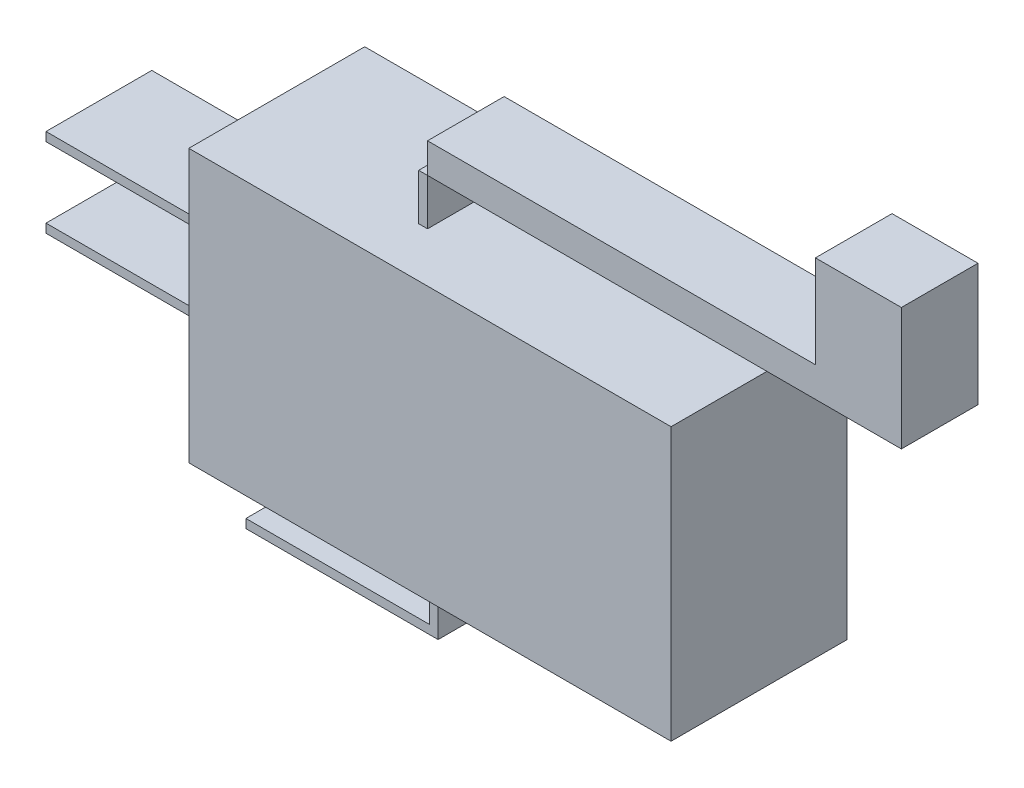
ISO-10303-21;
HEADER;
FILE_DESCRIPTION(('STEP AP214'),'2;1');
FILE_NAME('part.step','',(''),(''),'','','');
FILE_SCHEMA(('AUTOMOTIVE_DESIGN { 1 0 10303 214 1 1 1 1 }'));
ENDSEC;
DATA;
#1=APPLICATION_CONTEXT('core data for automotive mechanical design processes');
#2=APPLICATION_PROTOCOL_DEFINITION('international standard','automotive_design',2000,#1);
#3=PRODUCT_CONTEXT('',#1,'mechanical');
#4=PRODUCT('Part','Part','',(#3));
#5=PRODUCT_RELATED_PRODUCT_CATEGORY('part','',(#4));
#6=PRODUCT_DEFINITION_FORMATION('','',#4);
#7=PRODUCT_DEFINITION_CONTEXT('part definition',#1,'design');
#8=PRODUCT_DEFINITION('design','',#6,#7);
#9=PRODUCT_DEFINITION_SHAPE('','',#8);
#10=(LENGTH_UNIT() NAMED_UNIT(*) SI_UNIT(.MILLI.,.METRE.));
#11=(NAMED_UNIT(*) PLANE_ANGLE_UNIT() SI_UNIT($,.RADIAN.));
#12=(NAMED_UNIT(*) SI_UNIT($,.STERADIAN.) SOLID_ANGLE_UNIT());
#13=UNCERTAINTY_MEASURE_WITH_UNIT(LENGTH_MEASURE(1.E-05),#10,'distance_accuracy_value','');
#14=(GEOMETRIC_REPRESENTATION_CONTEXT(3) GLOBAL_UNCERTAINTY_ASSIGNED_CONTEXT((#13)) GLOBAL_UNIT_ASSIGNED_CONTEXT((#10,
#11,#12)) REPRESENTATION_CONTEXT('',''));
#15=CARTESIAN_POINT('',(0.,0.,0.));
#16=DIRECTION('',(0.,0.,1.));
#17=DIRECTION('',(1.,0.,0.));
#18=AXIS2_PLACEMENT_3D('',#15,#16,#17);
#19=CARTESIAN_POINT('',(10.8966,0.,0.));
#20=DIRECTION('',(-1.,0.,0.));
#21=DIRECTION('',(0.,0.,1.));
#22=AXIS2_PLACEMENT_3D('',#19,#20,#21);
#23=PLANE('',#22);
#24=DIRECTION('',(0.,-1.,0.));
#25=VECTOR('',#24,1.);
#26=CARTESIAN_POINT('',(10.8966,18.3642,7.2771));
#27=LINE('',#26,#25);
#28=CARTESIAN_POINT('',(10.8966,20.0914,7.2771));
#29=VERTEX_POINT('',#28);
#30=CARTESIAN_POINT('',(10.8966,18.3642,7.2771));
#31=VERTEX_POINT('',#30);
#32=EDGE_CURVE('E128',#29,#31,#27,.T.);
#33=ORIENTED_EDGE('',*,*,#32,.F.);
#34=DIRECTION('',(0.,0.,1.));
#35=VECTOR('',#34,1.);
#36=CARTESIAN_POINT('',(10.8966,20.0914,7.2771));
#37=LINE('',#36,#35);
#38=CARTESIAN_POINT('',(10.8966,20.0914,2.862513581114));
#39=VERTEX_POINT('',#38);
#40=EDGE_CURVE('E122',#39,#29,#37,.T.);
#41=ORIENTED_EDGE('',*,*,#40,.F.);
#42=DIRECTION('',(0.,1.,0.));
#43=VECTOR('',#42,1.);
#44=CARTESIAN_POINT('',(10.8966,18.3642,2.862513581114));
#45=LINE('',#44,#43);
#46=CARTESIAN_POINT('',(10.8966,18.3642,2.862513581114));
#47=VERTEX_POINT('',#46);
#48=EDGE_CURVE('E121',#47,#39,#45,.T.);
#49=ORIENTED_EDGE('',*,*,#48,.F.);
#50=DIRECTION('',(0.,0.,-1.));
#51=VECTOR('',#50,1.);
#52=CARTESIAN_POINT('',(10.8966,18.3642,7.2771));
#53=LINE('',#52,#51);
#54=EDGE_CURVE('E81',#31,#47,#53,.T.);
#55=ORIENTED_EDGE('',*,*,#54,.F.);
#56=EDGE_LOOP('',(#33,#41,#49,#55));
#57=FACE_BOUND('',#56,.T.);
#58=ADVANCED_FACE('F42',(#57),#23,.T.);
#59=CARTESIAN_POINT('',(38.2016,18.3642,7.2771));
#60=DIRECTION('',(0.,0.,-1.));
#61=DIRECTION('',(-1.,0.,0.));
#62=AXIS2_PLACEMENT_3D('',#59,#60,#61);
#63=PLANE('',#62);
#64=DIRECTION('',(-1.,0.,0.));
#65=VECTOR('',#64,1.);
#66=CARTESIAN_POINT('',(38.2016,25.4254,7.2771));
#67=LINE('',#66,#65);
#68=CARTESIAN_POINT('',(38.2016,25.4254,7.2771));
#69=VERTEX_POINT('',#68);
#70=CARTESIAN_POINT('',(33.2486,25.4254,7.2771));
#71=VERTEX_POINT('',#70);
#72=EDGE_CURVE('E136',#69,#71,#67,.T.);
#73=ORIENTED_EDGE('',*,*,#72,.T.);
#74=DIRECTION('',(0.,1.,0.));
#75=VECTOR('',#74,1.);
#76=CARTESIAN_POINT('',(33.2486,20.0914,7.2771));
#77=LINE('',#76,#75);
#78=CARTESIAN_POINT('',(33.2486,20.0914,7.2771));
#79=VERTEX_POINT('',#78);
#80=EDGE_CURVE('E111',#79,#71,#77,.T.);
#81=ORIENTED_EDGE('',*,*,#80,.F.);
#82=DIRECTION('',(1.,0.,0.));
#83=VECTOR('',#82,1.);
#84=CARTESIAN_POINT('',(33.2486,20.0914,7.2771));
#85=LINE('',#84,#83);
#86=EDGE_CURVE('E112',#29,#79,#85,.T.);
#87=ORIENTED_EDGE('',*,*,#86,.F.);
#88=ORIENTED_EDGE('',*,*,#32,.T.);
#89=DIRECTION('',(-1.,0.,0.));
#90=VECTOR('',#89,1.);
#91=CARTESIAN_POINT('',(38.2016,18.3642,7.2771));
#92=LINE('',#91,#90);
#93=CARTESIAN_POINT('',(38.2016,18.3642,7.2771));
#94=VERTEX_POINT('',#93);
#95=EDGE_CURVE('E12',#94,#31,#92,.T.);
#96=ORIENTED_EDGE('',*,*,#95,.F.);
#97=DIRECTION('',(0.,-1.,0.));
#98=VECTOR('',#97,1.);
#99=CARTESIAN_POINT('',(38.2016,18.3642,7.2771));
#100=LINE('',#99,#98);
#101=EDGE_CURVE('E130',#69,#94,#100,.T.);
#102=ORIENTED_EDGE('',*,*,#101,.F.);
#103=EDGE_LOOP('',(#73,#81,#87,#88,#96,#102));
#104=FACE_BOUND('',#103,.T.);
#105=ADVANCED_FACE('F44',(#104),#63,.F.);
#106=CARTESIAN_POINT('',(38.2016,18.3642,7.2771));
#107=DIRECTION('',(0.,1.,0.));
#108=DIRECTION('',(0.,0.,1.));
#109=AXIS2_PLACEMENT_3D('',#106,#107,#108);
#110=PLANE('',#109);
#111=ORIENTED_EDGE('',*,*,#54,.T.);
#112=DIRECTION('',(-1.,0.,0.));
#113=VECTOR('',#112,1.);
#114=CARTESIAN_POINT('',(38.2016,18.3642,2.862513581114));
#115=LINE('',#114,#113);
#116=CARTESIAN_POINT('',(38.2016,18.3642,2.862513581114));
#117=VERTEX_POINT('',#116);
#118=EDGE_CURVE('E50',#117,#47,#115,.T.);
#119=ORIENTED_EDGE('',*,*,#118,.F.);
#120=DIRECTION('',(0.,0.,-1.));
#121=VECTOR('',#120,1.);
#122=CARTESIAN_POINT('',(38.2016,18.3642,7.2771));
#123=LINE('',#122,#121);
#124=EDGE_CURVE('E86',#94,#117,#123,.T.);
#125=ORIENTED_EDGE('',*,*,#124,.F.);
#126=ORIENTED_EDGE('',*,*,#95,.T.);
#127=EDGE_LOOP('',(#111,#119,#125,#126));
#128=FACE_BOUND('',#127,.T.);
#129=ADVANCED_FACE('F165',(#128),#110,.F.);
#130=CARTESIAN_POINT('',(38.2016,18.3642,2.862513581114));
#131=DIRECTION('',(0.,0.,1.));
#132=DIRECTION('',(1.,0.,0.));
#133=AXIS2_PLACEMENT_3D('',#130,#131,#132);
#134=PLANE('',#133);
#135=DIRECTION('',(-1.,0.,0.));
#136=VECTOR('',#135,1.);
#137=CARTESIAN_POINT('',(33.2486,20.0914,2.862513581114));
#138=LINE('',#137,#136);
#139=CARTESIAN_POINT('',(33.2486,20.0914,2.862513581114));
#140=VERTEX_POINT('',#139);
#141=EDGE_CURVE('E57',#140,#39,#138,.T.);
#142=ORIENTED_EDGE('',*,*,#141,.F.);
#143=DIRECTION('',(0.,1.,0.));
#144=VECTOR('',#143,1.);
#145=CARTESIAN_POINT('',(33.2486,20.0914,2.862513581114));
#146=LINE('',#145,#144);
#147=CARTESIAN_POINT('',(33.2486,25.4254,2.862513581114));
#148=VERTEX_POINT('',#147);
#149=EDGE_CURVE('E102',#140,#148,#146,.T.);
#150=ORIENTED_EDGE('',*,*,#149,.T.);
#151=DIRECTION('',(-1.,0.,0.));
#152=VECTOR('',#151,1.);
#153=CARTESIAN_POINT('',(38.2016,25.4254,2.862513581114));
#154=LINE('',#153,#152);
#155=CARTESIAN_POINT('',(38.2016,25.4254,2.862513581114));
#156=VERTEX_POINT('',#155);
#157=EDGE_CURVE('E142',#156,#148,#154,.T.);
#158=ORIENTED_EDGE('',*,*,#157,.F.);
#159=DIRECTION('',(0.,1.,0.));
#160=VECTOR('',#159,1.);
#161=CARTESIAN_POINT('',(38.2016,18.3642,2.862513581114));
#162=LINE('',#161,#160);
#163=EDGE_CURVE('E133',#117,#156,#162,.T.);
#164=ORIENTED_EDGE('',*,*,#163,.F.);
#165=ORIENTED_EDGE('',*,*,#118,.T.);
#166=ORIENTED_EDGE('',*,*,#48,.T.);
#167=EDGE_LOOP('',(#142,#150,#158,#164,#165,#166));
#168=FACE_BOUND('',#167,.T.);
#169=ADVANCED_FACE('F119',(#168),#134,.F.);
#170=CARTESIAN_POINT('',(38.2016,25.4254,7.2771));
#171=DIRECTION('',(0.,-1.,0.));
#172=DIRECTION('',(0.,0.,-1.));
#173=AXIS2_PLACEMENT_3D('',#170,#171,#172);
#174=PLANE('',#173);
#175=ORIENTED_EDGE('',*,*,#157,.T.);
#176=DIRECTION('',(0.,0.,-1.));
#177=VECTOR('',#176,1.);
#178=CARTESIAN_POINT('',(33.2486,25.4254,7.2771));
#179=LINE('',#178,#177);
#180=EDGE_CURVE('E107',#71,#148,#179,.T.);
#181=ORIENTED_EDGE('',*,*,#180,.F.);
#182=ORIENTED_EDGE('',*,*,#72,.F.);
#183=DIRECTION('',(0.,0.,1.));
#184=VECTOR('',#183,1.);
#185=CARTESIAN_POINT('',(38.2016,25.4254,7.2771));
#186=LINE('',#185,#184);
#187=EDGE_CURVE('E66',#156,#69,#186,.T.);
#188=ORIENTED_EDGE('',*,*,#187,.F.);
#189=EDGE_LOOP('',(#175,#181,#182,#188));
#190=FACE_BOUND('',#189,.T.);
#191=ADVANCED_FACE('F150',(#190),#174,.F.);
#192=CARTESIAN_POINT('',(38.2016,0.,0.));
#193=DIRECTION('',(-1.,0.,0.));
#194=DIRECTION('',(0.,0.,1.));
#195=AXIS2_PLACEMENT_3D('',#192,#193,#194);
#196=PLANE('',#195);
#197=ORIENTED_EDGE('',*,*,#101,.T.);
#198=ORIENTED_EDGE('',*,*,#124,.T.);
#199=ORIENTED_EDGE('',*,*,#163,.T.);
#200=ORIENTED_EDGE('',*,*,#187,.T.);
#201=EDGE_LOOP('',(#197,#198,#199,#200));
#202=FACE_BOUND('',#201,.T.);
#203=ADVANCED_FACE('F151',(#202),#196,.F.);
#204=CARTESIAN_POINT('',(33.2486,20.0914,7.2771));
#205=DIRECTION('',(1.,0.,0.));
#206=DIRECTION('',(0.,0.,-1.));
#207=AXIS2_PLACEMENT_3D('',#204,#205,#206);
#208=PLANE('',#207);
#209=ORIENTED_EDGE('',*,*,#180,.T.);
#210=ORIENTED_EDGE('',*,*,#149,.F.);
#211=DIRECTION('',(0.,0.,-1.));
#212=VECTOR('',#211,1.);
#213=CARTESIAN_POINT('',(33.2486,20.0914,7.2771));
#214=LINE('',#213,#212);
#215=EDGE_CURVE('E104',#79,#140,#214,.T.);
#216=ORIENTED_EDGE('',*,*,#215,.F.);
#217=ORIENTED_EDGE('',*,*,#80,.T.);
#218=EDGE_LOOP('',(#209,#210,#216,#217));
#219=FACE_BOUND('',#218,.T.);
#220=ADVANCED_FACE('F103',(#219),#208,.F.);
#221=CARTESIAN_POINT('',(0.,20.0914,0.));
#222=DIRECTION('',(0.,1.,0.));
#223=DIRECTION('',(0.,0.,1.));
#224=AXIS2_PLACEMENT_3D('',#221,#222,#223);
#225=PLANE('',#224);
#226=ORIENTED_EDGE('',*,*,#215,.T.);
#227=ORIENTED_EDGE('',*,*,#141,.T.);
#228=ORIENTED_EDGE('',*,*,#40,.T.);
#229=ORIENTED_EDGE('',*,*,#86,.T.);
#230=EDGE_LOOP('',(#226,#227,#228,#229));
#231=FACE_BOUND('',#230,.T.);
#232=ADVANCED_FACE('F114',(#231),#225,.T.);
#233=CLOSED_SHELL('',(#58,#105,#129,#169,#191,#203,#220,#232));
#234=MANIFOLD_SOLID_BREP('B2',#233);
#235=CARTESIAN_POINT('',(11.8364,-3.6576,8.1153));
#236=DIRECTION('',(1.,0.,0.));
#237=DIRECTION('',(0.,0.,-1.));
#238=AXIS2_PLACEMENT_3D('',#235,#236,#237);
#239=PLANE('',#238);
#240=DIRECTION('',(0.,0.,-1.));
#241=VECTOR('',#240,1.);
#242=CARTESIAN_POINT('',(11.8364,-3.1496,8.1153));
#243=LINE('',#242,#241);
#244=CARTESIAN_POINT('',(11.8364,-3.1496,8.1153));
#245=VERTEX_POINT('',#244);
#246=CARTESIAN_POINT('',(11.8364,-3.1496,2.0193));
#247=VERTEX_POINT('',#246);
#248=EDGE_CURVE('E387',#245,#247,#243,.T.);
#249=ORIENTED_EDGE('',*,*,#248,.F.);
#250=DIRECTION('',(0.,1.,0.));
#251=VECTOR('',#250,1.);
#252=CARTESIAN_POINT('',(11.8364,-3.6576,8.1153));
#253=LINE('',#252,#251);
#254=CARTESIAN_POINT('',(11.8364,0.,8.1153));
#255=VERTEX_POINT('',#254);
#256=EDGE_CURVE('E392',#245,#255,#253,.T.);
#257=ORIENTED_EDGE('',*,*,#256,.T.);
#258=DIRECTION('',(0.,0.,-1.));
#259=VECTOR('',#258,1.);
#260=CARTESIAN_POINT('',(11.8364,0.,8.1153));
#261=LINE('',#260,#259);
#262=CARTESIAN_POINT('',(11.8364,0.,2.0193));
#263=VERTEX_POINT('',#262);
#264=EDGE_CURVE('E393',#255,#263,#261,.T.);
#265=ORIENTED_EDGE('',*,*,#264,.T.);
#266=DIRECTION('',(0.,1.,0.));
#267=VECTOR('',#266,1.);
#268=CARTESIAN_POINT('',(11.8364,-3.6576,2.0193));
#269=LINE('',#268,#267);
#270=EDGE_CURVE('E233',#247,#263,#269,.T.);
#271=ORIENTED_EDGE('',*,*,#270,.F.);
#272=EDGE_LOOP('',(#249,#257,#265,#271));
#273=FACE_BOUND('',#272,.T.);
#274=ADVANCED_FACE('F218',(#273),#239,.F.);
#275=CARTESIAN_POINT('',(0.,0.,10.1346));
#276=DIRECTION('',(0.,1.,0.));
#277=DIRECTION('',(0.,0.,1.));
#278=AXIS2_PLACEMENT_3D('',#275,#276,#277);
#279=PLANE('',#278);
#280=DIRECTION('',(1.,0.,0.));
#281=VECTOR('',#280,1.);
#282=CARTESIAN_POINT('',(0.,0.,0.));
#283=LINE('',#282,#281);
#284=CARTESIAN_POINT('',(0.,0.,0.));
#285=VERTEX_POINT('',#284);
#286=CARTESIAN_POINT('',(27.7876,0.,0.));
#287=VERTEX_POINT('',#286);
#288=EDGE_CURVE('E527',#285,#287,#283,.T.);
#289=ORIENTED_EDGE('',*,*,#288,.T.);
#290=DIRECTION('',(0.,0.,-1.));
#291=VECTOR('',#290,1.);
#292=CARTESIAN_POINT('',(27.7876,0.,10.1346));
#293=LINE('',#292,#291);
#294=CARTESIAN_POINT('',(27.7876,0.,10.1346));
#295=VERTEX_POINT('',#294);
#296=EDGE_CURVE('E226',#295,#287,#293,.T.);
#297=ORIENTED_EDGE('',*,*,#296,.F.);
#298=DIRECTION('',(1.,0.,0.));
#299=VECTOR('',#298,1.);
#300=CARTESIAN_POINT('',(0.,0.,10.1346));
#301=LINE('',#300,#299);
#302=CARTESIAN_POINT('',(0.,0.,10.1346));
#303=VERTEX_POINT('',#302);
#304=EDGE_CURVE('E517',#303,#295,#301,.T.);
#305=ORIENTED_EDGE('',*,*,#304,.F.);
#306=DIRECTION('',(0.,0.,-1.));
#307=VECTOR('',#306,1.);
#308=CARTESIAN_POINT('',(0.,0.,10.1346));
#309=LINE('',#308,#307);
#310=EDGE_CURVE('E40',#303,#285,#309,.T.);
#311=ORIENTED_EDGE('',*,*,#310,.T.);
#312=EDGE_LOOP('',(#289,#297,#305,#311));
#313=FACE_BOUND('',#312,.T.);
#314=ORIENTED_EDGE('',*,*,#264,.F.);
#315=DIRECTION('',(-1.,0.,0.));
#316=VECTOR('',#315,1.);
#317=CARTESIAN_POINT('',(12.3444,0.,8.1153));
#318=LINE('',#317,#316);
#319=CARTESIAN_POINT('',(12.3444,0.,8.1153));
#320=VERTEX_POINT('',#319);
#321=EDGE_CURVE('E404',#320,#255,#318,.T.);
#322=ORIENTED_EDGE('',*,*,#321,.F.);
#323=DIRECTION('',(0.,0.,1.));
#324=VECTOR('',#323,1.);
#325=CARTESIAN_POINT('',(12.3444,0.,8.1153));
#326=LINE('',#325,#324);
#327=CARTESIAN_POINT('',(12.3444,0.,2.0193));
#328=VERTEX_POINT('',#327);
#329=EDGE_CURVE('E240',#328,#320,#326,.T.);
#330=ORIENTED_EDGE('',*,*,#329,.F.);
#331=DIRECTION('',(1.,0.,0.));
#332=VECTOR('',#331,1.);
#333=CARTESIAN_POINT('',(12.3444,0.,2.0193));
#334=LINE('',#333,#332);
#335=EDGE_CURVE('E396',#263,#328,#334,.T.);
#336=ORIENTED_EDGE('',*,*,#335,.F.);
#337=EDGE_LOOP('',(#314,#322,#330,#336));
#338=FACE_BOUND('',#337,.T.);
#339=ADVANCED_FACE('F559',(#313,#338),#279,.F.);
#340=CARTESIAN_POINT('',(0.,15.6972,10.1346));
#341=DIRECTION('',(0.,-1.,0.));
#342=DIRECTION('',(0.,0.,-1.));
#343=AXIS2_PLACEMENT_3D('',#340,#341,#342);
#344=PLANE('',#343);
#345=DIRECTION('',(-1.,0.,0.));
#346=VECTOR('',#345,1.);
#347=CARTESIAN_POINT('',(0.,15.6972,0.));
#348=LINE('',#347,#346);
#349=CARTESIAN_POINT('',(27.7876,15.6972,0.));
#350=VERTEX_POINT('',#349);
#351=CARTESIAN_POINT('',(0.,15.6972,0.));
#352=VERTEX_POINT('',#351);
#353=EDGE_CURVE('E518',#350,#352,#348,.T.);
#354=ORIENTED_EDGE('',*,*,#353,.T.);
#355=DIRECTION('',(0.,0.,-1.));
#356=VECTOR('',#355,1.);
#357=CARTESIAN_POINT('',(0.,15.6972,10.1346));
#358=LINE('',#357,#356);
#359=CARTESIAN_POINT('',(0.,15.6972,10.1346));
#360=VERTEX_POINT('',#359);
#361=EDGE_CURVE('E524',#360,#352,#358,.T.);
#362=ORIENTED_EDGE('',*,*,#361,.F.);
#363=DIRECTION('',(-1.,0.,0.));
#364=VECTOR('',#363,1.);
#365=CARTESIAN_POINT('',(0.,15.6972,10.1346));
#366=LINE('',#365,#364);
#367=CARTESIAN_POINT('',(27.7876,15.6972,10.1346));
#368=VERTEX_POINT('',#367);
#369=EDGE_CURVE('E522',#368,#360,#366,.T.);
#370=ORIENTED_EDGE('',*,*,#369,.F.);
#371=DIRECTION('',(0.,0.,-1.));
#372=VECTOR('',#371,1.);
#373=CARTESIAN_POINT('',(27.7876,15.6972,10.1346));
#374=LINE('',#373,#372);
#375=EDGE_CURVE('E534',#368,#350,#374,.T.);
#376=ORIENTED_EDGE('',*,*,#375,.T.);
#377=EDGE_LOOP('',(#354,#362,#370,#376));
#378=FACE_BOUND('',#377,.T.);
#379=DIRECTION('',(0.,0.,-1.));
#380=VECTOR('',#379,1.);
#381=CARTESIAN_POINT('',(10.8966,15.6972,7.2771));
#382=LINE('',#381,#380);
#383=CARTESIAN_POINT('',(10.8966,15.6972,7.2771));
#384=VERTEX_POINT('',#383);
#385=CARTESIAN_POINT('',(10.8966,15.6972,2.8575));
#386=VERTEX_POINT('',#385);
#387=EDGE_CURVE('E419',#384,#386,#382,.T.);
#388=ORIENTED_EDGE('',*,*,#387,.F.);
#389=DIRECTION('',(1.,0.,0.));
#390=VECTOR('',#389,1.);
#391=CARTESIAN_POINT('',(10.3886,15.6972,7.2771));
#392=LINE('',#391,#390);
#393=CARTESIAN_POINT('',(10.3886,15.6972,7.2771));
#394=VERTEX_POINT('',#393);
#395=EDGE_CURVE('E423',#394,#384,#392,.T.);
#396=ORIENTED_EDGE('',*,*,#395,.F.);
#397=DIRECTION('',(0.,0.,1.));
#398=VECTOR('',#397,1.);
#399=CARTESIAN_POINT('',(10.3886,15.6972,7.2771));
#400=LINE('',#399,#398);
#401=CARTESIAN_POINT('',(10.3886,15.6972,2.8575));
#402=VERTEX_POINT('',#401);
#403=EDGE_CURVE('E435',#402,#394,#400,.T.);
#404=ORIENTED_EDGE('',*,*,#403,.F.);
#405=DIRECTION('',(-1.,0.,0.));
#406=VECTOR('',#405,1.);
#407=CARTESIAN_POINT('',(10.3886,15.6972,2.8575));
#408=LINE('',#407,#406);
#409=EDGE_CURVE('E432',#386,#402,#408,.T.);
#410=ORIENTED_EDGE('',*,*,#409,.F.);
#411=EDGE_LOOP('',(#388,#396,#404,#410));
#412=FACE_BOUND('',#411,.T.);
#413=ADVANCED_FACE('F550',(#378,#412),#344,.F.);
#414=CARTESIAN_POINT('',(0.,0.,10.1346));
#415=DIRECTION('',(1.,0.,0.));
#416=DIRECTION('',(0.,0.,-1.));
#417=AXIS2_PLACEMENT_3D('',#414,#415,#416);
#418=PLANE('',#417);
#419=DIRECTION('',(0.,-1.,0.));
#420=VECTOR('',#419,1.);
#421=CARTESIAN_POINT('',(0.,0.,0.));
#422=LINE('',#421,#420);
#423=EDGE_CURVE('E506',#352,#285,#422,.T.);
#424=ORIENTED_EDGE('',*,*,#423,.T.);
#425=ORIENTED_EDGE('',*,*,#310,.F.);
#426=DIRECTION('',(0.,-1.,0.));
#427=VECTOR('',#426,1.);
#428=CARTESIAN_POINT('',(0.,0.,10.1346));
#429=LINE('',#428,#427);
#430=EDGE_CURVE('E514',#360,#303,#429,.T.);
#431=ORIENTED_EDGE('',*,*,#430,.F.);
#432=ORIENTED_EDGE('',*,*,#361,.T.);
#433=EDGE_LOOP('',(#424,#425,#431,#432));
#434=FACE_BOUND('',#433,.T.);
#435=DIRECTION('',(0.,0.,1.));
#436=VECTOR('',#435,1.);
#437=CARTESIAN_POINT('',(0.,9.8806,2.0066));
#438=LINE('',#437,#436);
#439=CARTESIAN_POINT('',(0.,9.8806,2.0066));
#440=VERTEX_POINT('',#439);
#441=CARTESIAN_POINT('',(0.,9.8806,8.1026));
#442=VERTEX_POINT('',#441);
#443=EDGE_CURVE('E488',#440,#442,#438,.T.);
#444=ORIENTED_EDGE('',*,*,#443,.F.);
#445=DIRECTION('',(0.,1.,0.));
#446=VECTOR('',#445,1.);
#447=CARTESIAN_POINT('',(0.,9.8806,2.0066));
#448=LINE('',#447,#446);
#449=CARTESIAN_POINT('',(0.,10.3886,2.0066));
#450=VERTEX_POINT('',#449);
#451=EDGE_CURVE('E474',#440,#450,#448,.T.);
#452=ORIENTED_EDGE('',*,*,#451,.T.);
#453=DIRECTION('',(0.,0.,1.));
#454=VECTOR('',#453,1.);
#455=CARTESIAN_POINT('',(0.,10.3886,2.0066));
#456=LINE('',#455,#454);
#457=CARTESIAN_POINT('',(0.,10.3886,8.1026));
#458=VERTEX_POINT('',#457);
#459=EDGE_CURVE('E498',#450,#458,#456,.T.);
#460=ORIENTED_EDGE('',*,*,#459,.T.);
#461=DIRECTION('',(0.,1.,0.));
#462=VECTOR('',#461,1.);
#463=CARTESIAN_POINT('',(0.,9.8806,8.1026));
#464=LINE('',#463,#462);
#465=EDGE_CURVE('E501',#442,#458,#464,.T.);
#466=ORIENTED_EDGE('',*,*,#465,.F.);
#467=EDGE_LOOP('',(#444,#452,#460,#466));
#468=FACE_BOUND('',#467,.T.);
#469=DIRECTION('',(0.,-1.,0.));
#470=VECTOR('',#469,1.);
#471=CARTESIAN_POINT('',(0.,5.8166,2.0066));
#472=LINE('',#471,#470);
#473=CARTESIAN_POINT('',(0.,5.8166,2.0066));
#474=VERTEX_POINT('',#473);
#475=CARTESIAN_POINT('',(0.,5.3086,2.0066));
#476=VERTEX_POINT('',#475);
#477=EDGE_CURVE('E471',#474,#476,#472,.T.);
#478=ORIENTED_EDGE('',*,*,#477,.F.);
#479=DIRECTION('',(0.,0.,1.));
#480=VECTOR('',#479,1.);
#481=CARTESIAN_POINT('',(0.,5.8166,2.0066));
#482=LINE('',#481,#480);
#483=CARTESIAN_POINT('',(0.,5.8166,8.1026));
#484=VERTEX_POINT('',#483);
#485=EDGE_CURVE('E461',#474,#484,#482,.T.);
#486=ORIENTED_EDGE('',*,*,#485,.T.);
#487=DIRECTION('',(0.,-1.,0.));
#488=VECTOR('',#487,1.);
#489=CARTESIAN_POINT('',(0.,5.8166,8.1026));
#490=LINE('',#489,#488);
#491=CARTESIAN_POINT('',(0.,5.3086,8.1026));
#492=VERTEX_POINT('',#491);
#493=EDGE_CURVE('E464',#484,#492,#490,.T.);
#494=ORIENTED_EDGE('',*,*,#493,.T.);
#495=DIRECTION('',(0.,0.,1.));
#496=VECTOR('',#495,1.);
#497=CARTESIAN_POINT('',(0.,5.3086,2.0066));
#498=LINE('',#497,#496);
#499=EDGE_CURVE('E468',#476,#492,#498,.T.);
#500=ORIENTED_EDGE('',*,*,#499,.F.);
#501=EDGE_LOOP('',(#478,#486,#494,#500));
#502=FACE_BOUND('',#501,.T.);
#503=ADVANCED_FACE('F220',(#434,#468,#502),#418,.F.);
#504=CARTESIAN_POINT('',(27.7876,0.,10.1346));
#505=DIRECTION('',(-1.,0.,0.));
#506=DIRECTION('',(0.,0.,1.));
#507=AXIS2_PLACEMENT_3D('',#504,#505,#506);
#508=PLANE('',#507);
#509=DIRECTION('',(0.,1.,0.));
#510=VECTOR('',#509,1.);
#511=CARTESIAN_POINT('',(27.7876,0.,0.));
#512=LINE('',#511,#510);
#513=EDGE_CURVE('E529',#287,#350,#512,.T.);
#514=ORIENTED_EDGE('',*,*,#513,.T.);
#515=ORIENTED_EDGE('',*,*,#375,.F.);
#516=DIRECTION('',(0.,1.,0.));
#517=VECTOR('',#516,1.);
#518=CARTESIAN_POINT('',(27.7876,0.,10.1346));
#519=LINE('',#518,#517);
#520=EDGE_CURVE('E520',#295,#368,#519,.T.);
#521=ORIENTED_EDGE('',*,*,#520,.F.);
#522=ORIENTED_EDGE('',*,*,#296,.T.);
#523=EDGE_LOOP('',(#514,#515,#521,#522));
#524=FACE_BOUND('',#523,.T.);
#525=ADVANCED_FACE('F541',(#524),#508,.F.);
#526=CARTESIAN_POINT('',(0.,0.,10.1346));
#527=DIRECTION('',(0.,0.,-1.));
#528=DIRECTION('',(-1.,0.,0.));
#529=AXIS2_PLACEMENT_3D('',#526,#527,#528);
#530=PLANE('',#529);
#531=ORIENTED_EDGE('',*,*,#430,.T.);
#532=ORIENTED_EDGE('',*,*,#304,.T.);
#533=ORIENTED_EDGE('',*,*,#520,.T.);
#534=ORIENTED_EDGE('',*,*,#369,.T.);
#535=EDGE_LOOP('',(#531,#532,#533,#534));
#536=FACE_BOUND('',#535,.T.);
#537=ADVANCED_FACE('F558',(#536),#530,.F.);
#538=CARTESIAN_POINT('',(0.,0.,0.));
#539=DIRECTION('',(0.,0.,-1.));
#540=DIRECTION('',(-1.,0.,0.));
#541=AXIS2_PLACEMENT_3D('',#538,#539,#540);
#542=PLANE('',#541);
#543=ORIENTED_EDGE('',*,*,#423,.F.);
#544=ORIENTED_EDGE('',*,*,#353,.F.);
#545=ORIENTED_EDGE('',*,*,#513,.F.);
#546=ORIENTED_EDGE('',*,*,#288,.F.);
#547=EDGE_LOOP('',(#543,#544,#545,#546));
#548=FACE_BOUND('',#547,.T.);
#549=ADVANCED_FACE('F547',(#548),#542,.T.);
#550=CARTESIAN_POINT('',(-10.2616,9.8806,2.0066));
#551=DIRECTION('',(0.,0.,-1.));
#552=DIRECTION('',(-1.,0.,0.));
#553=AXIS2_PLACEMENT_3D('',#550,#551,#552);
#554=PLANE('',#553);
#555=ORIENTED_EDGE('',*,*,#451,.F.);
#556=DIRECTION('',(1.,0.,0.));
#557=VECTOR('',#556,1.);
#558=CARTESIAN_POINT('',(-10.2616,9.8806,2.0066));
#559=LINE('',#558,#557);
#560=CARTESIAN_POINT('',(-10.2616,9.8806,2.0066));
#561=VERTEX_POINT('',#560);
#562=EDGE_CURVE('E504',#561,#440,#559,.T.);
#563=ORIENTED_EDGE('',*,*,#562,.F.);
#564=DIRECTION('',(0.,1.,0.));
#565=VECTOR('',#564,1.);
#566=CARTESIAN_POINT('',(-10.2616,9.8806,2.0066));
#567=LINE('',#566,#565);
#568=CARTESIAN_POINT('',(-10.2616,10.3886,2.0066));
#569=VERTEX_POINT('',#568);
#570=EDGE_CURVE('E484',#561,#569,#567,.T.);
#571=ORIENTED_EDGE('',*,*,#570,.T.);
#572=DIRECTION('',(1.,0.,0.));
#573=VECTOR('',#572,1.);
#574=CARTESIAN_POINT('',(-10.2616,10.3886,2.0066));
#575=LINE('',#574,#573);
#576=EDGE_CURVE('E495',#569,#450,#575,.T.);
#577=ORIENTED_EDGE('',*,*,#576,.T.);
#578=EDGE_LOOP('',(#555,#563,#571,#577));
#579=FACE_BOUND('',#578,.T.);
#580=ADVANCED_FACE('F631',(#579),#554,.T.);
#581=CARTESIAN_POINT('',(-10.2616,9.8806,2.0066));
#582=DIRECTION('',(0.,1.,0.));
#583=DIRECTION('',(0.,0.,1.));
#584=AXIS2_PLACEMENT_3D('',#581,#582,#583);
#585=PLANE('',#584);
#586=ORIENTED_EDGE('',*,*,#443,.T.);
#587=DIRECTION('',(1.,0.,0.));
#588=VECTOR('',#587,1.);
#589=CARTESIAN_POINT('',(-10.2616,9.8806,8.1026));
#590=LINE('',#589,#588);
#591=CARTESIAN_POINT('',(-10.2616,9.8806,8.1026));
#592=VERTEX_POINT('',#591);
#593=EDGE_CURVE('E507',#592,#442,#590,.T.);
#594=ORIENTED_EDGE('',*,*,#593,.F.);
#595=DIRECTION('',(0.,0.,1.));
#596=VECTOR('',#595,1.);
#597=CARTESIAN_POINT('',(-10.2616,9.8806,2.0066));
#598=LINE('',#597,#596);
#599=EDGE_CURVE('E493',#561,#592,#598,.T.);
#600=ORIENTED_EDGE('',*,*,#599,.F.);
#601=ORIENTED_EDGE('',*,*,#562,.T.);
#602=EDGE_LOOP('',(#586,#594,#600,#601));
#603=FACE_BOUND('',#602,.T.);
#604=ADVANCED_FACE('F627',(#603),#585,.F.);
#605=CARTESIAN_POINT('',(-10.2616,9.8806,8.1026));
#606=DIRECTION('',(0.,0.,-1.));
#607=DIRECTION('',(-1.,0.,0.));
#608=AXIS2_PLACEMENT_3D('',#605,#606,#607);
#609=PLANE('',#608);
#610=ORIENTED_EDGE('',*,*,#465,.T.);
#611=DIRECTION('',(1.,0.,0.));
#612=VECTOR('',#611,1.);
#613=CARTESIAN_POINT('',(-10.2616,10.3886,8.1026));
#614=LINE('',#613,#612);
#615=CARTESIAN_POINT('',(-10.2616,10.3886,8.1026));
#616=VERTEX_POINT('',#615);
#617=EDGE_CURVE('E510',#616,#458,#614,.T.);
#618=ORIENTED_EDGE('',*,*,#617,.F.);
#619=DIRECTION('',(0.,1.,0.));
#620=VECTOR('',#619,1.);
#621=CARTESIAN_POINT('',(-10.2616,9.8806,8.1026));
#622=LINE('',#621,#620);
#623=EDGE_CURVE('E491',#592,#616,#622,.T.);
#624=ORIENTED_EDGE('',*,*,#623,.F.);
#625=ORIENTED_EDGE('',*,*,#593,.T.);
#626=EDGE_LOOP('',(#610,#618,#624,#625));
#627=FACE_BOUND('',#626,.T.);
#628=ADVANCED_FACE('F630',(#627),#609,.F.);
#629=CARTESIAN_POINT('',(-10.2616,10.3886,2.0066));
#630=DIRECTION('',(0.,1.,0.));
#631=DIRECTION('',(0.,0.,1.));
#632=AXIS2_PLACEMENT_3D('',#629,#630,#631);
#633=PLANE('',#632);
#634=ORIENTED_EDGE('',*,*,#459,.F.);
#635=ORIENTED_EDGE('',*,*,#576,.F.);
#636=DIRECTION('',(0.,0.,1.));
#637=VECTOR('',#636,1.);
#638=CARTESIAN_POINT('',(-10.2616,10.3886,2.0066));
#639=LINE('',#638,#637);
#640=EDGE_CURVE('E487',#569,#616,#639,.T.);
#641=ORIENTED_EDGE('',*,*,#640,.T.);
#642=ORIENTED_EDGE('',*,*,#617,.T.);
#643=EDGE_LOOP('',(#634,#635,#641,#642));
#644=FACE_BOUND('',#643,.T.);
#645=ADVANCED_FACE('F625',(#644),#633,.T.);
#646=CARTESIAN_POINT('',(-10.2616,0.,0.));
#647=DIRECTION('',(1.,0.,0.));
#648=DIRECTION('',(0.,0.,-1.));
#649=AXIS2_PLACEMENT_3D('',#646,#647,#648);
#650=PLANE('',#649);
#651=ORIENTED_EDGE('',*,*,#570,.F.);
#652=ORIENTED_EDGE('',*,*,#599,.T.);
#653=ORIENTED_EDGE('',*,*,#623,.T.);
#654=ORIENTED_EDGE('',*,*,#640,.F.);
#655=EDGE_LOOP('',(#651,#652,#653,#654));
#656=FACE_BOUND('',#655,.T.);
#657=ADVANCED_FACE('F607',(#656),#650,.F.);
#658=CARTESIAN_POINT('',(-10.2616,5.8166,2.0066));
#659=DIRECTION('',(0.,0.,1.));
#660=DIRECTION('',(1.,0.,0.));
#661=AXIS2_PLACEMENT_3D('',#658,#659,#660);
#662=PLANE('',#661);
#663=ORIENTED_EDGE('',*,*,#477,.T.);
#664=DIRECTION('',(1.,0.,0.));
#665=VECTOR('',#664,1.);
#666=CARTESIAN_POINT('',(-10.2616,5.3086,2.0066));
#667=LINE('',#666,#665);
#668=CARTESIAN_POINT('',(-10.2616,5.3086,2.0066));
#669=VERTEX_POINT('',#668);
#670=EDGE_CURVE('E451',#669,#476,#667,.T.);
#671=ORIENTED_EDGE('',*,*,#670,.F.);
#672=DIRECTION('',(0.,-1.,0.));
#673=VECTOR('',#672,1.);
#674=CARTESIAN_POINT('',(-10.2616,5.8166,2.0066));
#675=LINE('',#674,#673);
#676=CARTESIAN_POINT('',(-10.2616,5.8166,2.0066));
#677=VERTEX_POINT('',#676);
#678=EDGE_CURVE('E465',#677,#669,#675,.T.);
#679=ORIENTED_EDGE('',*,*,#678,.F.);
#680=DIRECTION('',(1.,0.,0.));
#681=VECTOR('',#680,1.);
#682=CARTESIAN_POINT('',(-10.2616,5.8166,2.0066));
#683=LINE('',#682,#681);
#684=EDGE_CURVE('E458',#677,#474,#683,.T.);
#685=ORIENTED_EDGE('',*,*,#684,.T.);
#686=EDGE_LOOP('',(#663,#671,#679,#685));
#687=FACE_BOUND('',#686,.T.);
#688=ADVANCED_FACE('F603',(#687),#662,.F.);
#689=CARTESIAN_POINT('',(-10.2616,5.3086,2.0066));
#690=DIRECTION('',(0.,1.,0.));
#691=DIRECTION('',(0.,0.,1.));
#692=AXIS2_PLACEMENT_3D('',#689,#690,#691);
#693=PLANE('',#692);
#694=ORIENTED_EDGE('',*,*,#499,.T.);
#695=DIRECTION('',(1.,0.,0.));
#696=VECTOR('',#695,1.);
#697=CARTESIAN_POINT('',(-10.2616,5.3086,8.1026));
#698=LINE('',#697,#696);
#699=CARTESIAN_POINT('',(-10.2616,5.3086,8.1026));
#700=VERTEX_POINT('',#699);
#701=EDGE_CURVE('E453',#700,#492,#698,.T.);
#702=ORIENTED_EDGE('',*,*,#701,.F.);
#703=DIRECTION('',(0.,0.,1.));
#704=VECTOR('',#703,1.);
#705=CARTESIAN_POINT('',(-10.2616,5.3086,2.0066));
#706=LINE('',#705,#704);
#707=EDGE_CURVE('E480',#669,#700,#706,.T.);
#708=ORIENTED_EDGE('',*,*,#707,.F.);
#709=ORIENTED_EDGE('',*,*,#670,.T.);
#710=EDGE_LOOP('',(#694,#702,#708,#709));
#711=FACE_BOUND('',#710,.T.);
#712=ADVANCED_FACE('F606',(#711),#693,.F.);
#713=CARTESIAN_POINT('',(-10.2616,5.8166,8.1026));
#714=DIRECTION('',(0.,0.,1.));
#715=DIRECTION('',(1.,0.,0.));
#716=AXIS2_PLACEMENT_3D('',#713,#714,#715);
#717=PLANE('',#716);
#718=ORIENTED_EDGE('',*,*,#493,.F.);
#719=DIRECTION('',(1.,0.,0.));
#720=VECTOR('',#719,1.);
#721=CARTESIAN_POINT('',(-10.2616,5.8166,8.1026));
#722=LINE('',#721,#720);
#723=CARTESIAN_POINT('',(-10.2616,5.8166,8.1026));
#724=VERTEX_POINT('',#723);
#725=EDGE_CURVE('E455',#724,#484,#722,.T.);
#726=ORIENTED_EDGE('',*,*,#725,.F.);
#727=DIRECTION('',(0.,-1.,0.));
#728=VECTOR('',#727,1.);
#729=CARTESIAN_POINT('',(-10.2616,5.8166,8.1026));
#730=LINE('',#729,#728);
#731=EDGE_CURVE('E477',#724,#700,#730,.T.);
#732=ORIENTED_EDGE('',*,*,#731,.T.);
#733=ORIENTED_EDGE('',*,*,#701,.T.);
#734=EDGE_LOOP('',(#718,#726,#732,#733));
#735=FACE_BOUND('',#734,.T.);
#736=ADVANCED_FACE('F611',(#735),#717,.T.);
#737=CARTESIAN_POINT('',(-10.2616,5.8166,2.0066));
#738=DIRECTION('',(0.,1.,0.));
#739=DIRECTION('',(0.,0.,1.));
#740=AXIS2_PLACEMENT_3D('',#737,#738,#739);
#741=PLANE('',#740);
#742=ORIENTED_EDGE('',*,*,#485,.F.);
#743=ORIENTED_EDGE('',*,*,#684,.F.);
#744=DIRECTION('',(0.,0.,1.));
#745=VECTOR('',#744,1.);
#746=CARTESIAN_POINT('',(-10.2616,5.8166,2.0066));
#747=LINE('',#746,#745);
#748=EDGE_CURVE('E460',#677,#724,#747,.T.);
#749=ORIENTED_EDGE('',*,*,#748,.T.);
#750=ORIENTED_EDGE('',*,*,#725,.T.);
#751=EDGE_LOOP('',(#742,#743,#749,#750));
#752=FACE_BOUND('',#751,.T.);
#753=ADVANCED_FACE('F615',(#752),#741,.T.);
#754=CARTESIAN_POINT('',(-10.2616,0.,0.));
#755=DIRECTION('',(-1.,0.,0.));
#756=DIRECTION('',(0.,0.,1.));
#757=AXIS2_PLACEMENT_3D('',#754,#755,#756);
#758=PLANE('',#757);
#759=ORIENTED_EDGE('',*,*,#678,.T.);
#760=ORIENTED_EDGE('',*,*,#707,.T.);
#761=ORIENTED_EDGE('',*,*,#731,.F.);
#762=ORIENTED_EDGE('',*,*,#748,.F.);
#763=EDGE_LOOP('',(#759,#760,#761,#762));
#764=FACE_BOUND('',#763,.T.);
#765=ADVANCED_FACE('F601',(#764),#758,.T.);
#766=CARTESIAN_POINT('',(10.8966,18.3642,7.2771));
#767=DIRECTION('',(-1.,0.,0.));
#768=DIRECTION('',(0.,0.,1.));
#769=AXIS2_PLACEMENT_3D('',#766,#767,#768);
#770=PLANE('',#769);
#771=ORIENTED_EDGE('',*,*,#387,.T.);
#772=DIRECTION('',(0.,-1.,0.));
#773=VECTOR('',#772,1.);
#774=CARTESIAN_POINT('',(10.8966,18.3642,2.8575));
#775=LINE('',#774,#773);
#776=CARTESIAN_POINT('',(10.8966,18.3642,2.8575));
#777=VERTEX_POINT('',#776);
#778=EDGE_CURVE('E448',#777,#386,#775,.T.);
#779=ORIENTED_EDGE('',*,*,#778,.F.);
#780=DIRECTION('',(0.,0.,-1.));
#781=VECTOR('',#780,1.);
#782=CARTESIAN_POINT('',(10.8966,18.3642,7.2771));
#783=LINE('',#782,#781);
#784=CARTESIAN_POINT('',(10.8966,18.3642,7.2771));
#785=VERTEX_POINT('',#784);
#786=EDGE_CURVE('E420',#785,#777,#783,.T.);
#787=ORIENTED_EDGE('',*,*,#786,.F.);
#788=DIRECTION('',(0.,-1.,0.));
#789=VECTOR('',#788,1.);
#790=CARTESIAN_POINT('',(10.8966,18.3642,7.2771));
#791=LINE('',#790,#789);
#792=EDGE_CURVE('E429',#785,#384,#791,.T.);
#793=ORIENTED_EDGE('',*,*,#792,.T.);
#794=EDGE_LOOP('',(#771,#779,#787,#793));
#795=FACE_BOUND('',#794,.T.);
#796=ADVANCED_FACE('F597',(#795),#770,.F.);
#797=CARTESIAN_POINT('',(10.3886,18.3642,2.8575));
#798=DIRECTION('',(0.,0.,1.));
#799=DIRECTION('',(1.,0.,0.));
#800=AXIS2_PLACEMENT_3D('',#797,#798,#799);
#801=PLANE('',#800);
#802=ORIENTED_EDGE('',*,*,#409,.T.);
#803=DIRECTION('',(0.,-1.,0.));
#804=VECTOR('',#803,1.);
#805=CARTESIAN_POINT('',(10.3886,18.3642,2.8575));
#806=LINE('',#805,#804);
#807=CARTESIAN_POINT('',(10.3886,18.3642,2.8575));
#808=VERTEX_POINT('',#807);
#809=EDGE_CURVE('E445',#808,#402,#806,.T.);
#810=ORIENTED_EDGE('',*,*,#809,.F.);
#811=DIRECTION('',(-1.,0.,0.));
#812=VECTOR('',#811,1.);
#813=CARTESIAN_POINT('',(10.3886,18.3642,2.8575));
#814=LINE('',#813,#812);
#815=EDGE_CURVE('E422',#777,#808,#814,.T.);
#816=ORIENTED_EDGE('',*,*,#815,.F.);
#817=ORIENTED_EDGE('',*,*,#778,.T.);
#818=EDGE_LOOP('',(#802,#810,#816,#817));
#819=FACE_BOUND('',#818,.T.);
#820=ADVANCED_FACE('F593',(#819),#801,.F.);
#821=CARTESIAN_POINT('',(10.3886,18.3642,7.2771));
#822=DIRECTION('',(1.,0.,0.));
#823=DIRECTION('',(0.,0.,-1.));
#824=AXIS2_PLACEMENT_3D('',#821,#822,#823);
#825=PLANE('',#824);
#826=ORIENTED_EDGE('',*,*,#403,.T.);
#827=DIRECTION('',(0.,-1.,0.));
#828=VECTOR('',#827,1.);
#829=CARTESIAN_POINT('',(10.3886,18.3642,7.2771));
#830=LINE('',#829,#828);
#831=CARTESIAN_POINT('',(10.3886,18.3642,7.2771));
#832=VERTEX_POINT('',#831);
#833=EDGE_CURVE('E442',#832,#394,#830,.T.);
#834=ORIENTED_EDGE('',*,*,#833,.F.);
#835=DIRECTION('',(0.,0.,1.));
#836=VECTOR('',#835,1.);
#837=CARTESIAN_POINT('',(10.3886,18.3642,7.2771));
#838=LINE('',#837,#836);
#839=EDGE_CURVE('E425',#808,#832,#838,.T.);
#840=ORIENTED_EDGE('',*,*,#839,.F.);
#841=ORIENTED_EDGE('',*,*,#809,.T.);
#842=EDGE_LOOP('',(#826,#834,#840,#841));
#843=FACE_BOUND('',#842,.T.);
#844=ADVANCED_FACE('F589',(#843),#825,.F.);
#845=CARTESIAN_POINT('',(10.3886,18.3642,7.2771));
#846=DIRECTION('',(0.,0.,-1.));
#847=DIRECTION('',(-1.,0.,0.));
#848=AXIS2_PLACEMENT_3D('',#845,#846,#847);
#849=PLANE('',#848);
#850=ORIENTED_EDGE('',*,*,#395,.T.);
#851=ORIENTED_EDGE('',*,*,#792,.F.);
#852=DIRECTION('',(1.,0.,0.));
#853=VECTOR('',#852,1.);
#854=CARTESIAN_POINT('',(10.3886,18.3642,7.2771));
#855=LINE('',#854,#853);
#856=EDGE_CURVE('E427',#832,#785,#855,.T.);
#857=ORIENTED_EDGE('',*,*,#856,.F.);
#858=ORIENTED_EDGE('',*,*,#833,.T.);
#859=EDGE_LOOP('',(#850,#851,#857,#858));
#860=FACE_BOUND('',#859,.T.);
#861=ADVANCED_FACE('F585',(#860),#849,.F.);
#862=CARTESIAN_POINT('',(0.,18.3642,0.));
#863=DIRECTION('',(0.,-1.,0.));
#864=DIRECTION('',(0.,0.,-1.));
#865=AXIS2_PLACEMENT_3D('',#862,#863,#864);
#866=PLANE('',#865);
#867=ORIENTED_EDGE('',*,*,#786,.T.);
#868=ORIENTED_EDGE('',*,*,#815,.T.);
#869=ORIENTED_EDGE('',*,*,#839,.T.);
#870=ORIENTED_EDGE('',*,*,#856,.T.);
#871=EDGE_LOOP('',(#867,#868,#869,#870));
#872=FACE_BOUND('',#871,.T.);
#873=ADVANCED_FACE('F582',(#872),#866,.F.);
#874=CARTESIAN_POINT('',(12.3444,-3.6576,2.0193));
#875=DIRECTION('',(0.,0.,1.));
#876=DIRECTION('',(1.,0.,0.));
#877=AXIS2_PLACEMENT_3D('',#874,#875,#876);
#878=PLANE('',#877);
#879=ORIENTED_EDGE('',*,*,#335,.T.);
#880=DIRECTION('',(0.,1.,0.));
#881=VECTOR('',#880,1.);
#882=CARTESIAN_POINT('',(12.3444,-3.6576,2.0193));
#883=LINE('',#882,#881);
#884=CARTESIAN_POINT('',(12.3444,-3.6576,2.0193));
#885=VERTEX_POINT('',#884);
#886=EDGE_CURVE('E415',#885,#328,#883,.T.);
#887=ORIENTED_EDGE('',*,*,#886,.F.);
#888=DIRECTION('',(1.,0.,0.));
#889=VECTOR('',#888,1.);
#890=CARTESIAN_POINT('',(12.3444,-3.6576,2.0193));
#891=LINE('',#890,#889);
#892=CARTESIAN_POINT('',(1.27000000000001,-3.6576,2.0193));
#893=VERTEX_POINT('',#892);
#894=EDGE_CURVE('E401',#893,#885,#891,.T.);
#895=ORIENTED_EDGE('',*,*,#894,.F.);
#896=DIRECTION('',(0.,-1.,0.));
#897=VECTOR('',#896,1.);
#898=CARTESIAN_POINT('',(1.27000000000001,-3.6576,2.0193));
#899=LINE('',#898,#897);
#900=CARTESIAN_POINT('',(1.27000000000001,-3.1496,2.0193));
#901=VERTEX_POINT('',#900);
#902=EDGE_CURVE('E377',#901,#893,#899,.T.);
#903=ORIENTED_EDGE('',*,*,#902,.F.);
#904=DIRECTION('',(1.,0.,0.));
#905=VECTOR('',#904,1.);
#906=CARTESIAN_POINT('',(1.27000000000001,-3.1496,2.0193));
#907=LINE('',#906,#905);
#908=EDGE_CURVE('E373',#901,#247,#907,.T.);
#909=ORIENTED_EDGE('',*,*,#908,.T.);
#910=ORIENTED_EDGE('',*,*,#270,.T.);
#911=EDGE_LOOP('',(#879,#887,#895,#903,#909,#910));
#912=FACE_BOUND('',#911,.T.);
#913=ADVANCED_FACE('F568',(#912),#878,.F.);
#914=CARTESIAN_POINT('',(12.3444,-3.6576,8.1153));
#915=DIRECTION('',(-1.,0.,0.));
#916=DIRECTION('',(0.,0.,1.));
#917=AXIS2_PLACEMENT_3D('',#914,#915,#916);
#918=PLANE('',#917);
#919=ORIENTED_EDGE('',*,*,#329,.T.);
#920=DIRECTION('',(0.,1.,0.));
#921=VECTOR('',#920,1.);
#922=CARTESIAN_POINT('',(12.3444,-3.6576,8.1153));
#923=LINE('',#922,#921);
#924=CARTESIAN_POINT('',(12.3444,-3.6576,8.1153));
#925=VERTEX_POINT('',#924);
#926=EDGE_CURVE('E412',#925,#320,#923,.T.);
#927=ORIENTED_EDGE('',*,*,#926,.F.);
#928=DIRECTION('',(0.,0.,1.));
#929=VECTOR('',#928,1.);
#930=CARTESIAN_POINT('',(12.3444,-3.6576,8.1153));
#931=LINE('',#930,#929);
#932=EDGE_CURVE('E403',#885,#925,#931,.T.);
#933=ORIENTED_EDGE('',*,*,#932,.F.);
#934=ORIENTED_EDGE('',*,*,#886,.T.);
#935=EDGE_LOOP('',(#919,#927,#933,#934));
#936=FACE_BOUND('',#935,.T.);
#937=ADVANCED_FACE('F566',(#936),#918,.F.);
#938=CARTESIAN_POINT('',(12.3444,-3.6576,8.1153));
#939=DIRECTION('',(0.,0.,-1.));
#940=DIRECTION('',(-1.,0.,0.));
#941=AXIS2_PLACEMENT_3D('',#938,#939,#940);
#942=PLANE('',#941);
#943=ORIENTED_EDGE('',*,*,#321,.T.);
#944=ORIENTED_EDGE('',*,*,#256,.F.);
#945=DIRECTION('',(1.,0.,0.));
#946=VECTOR('',#945,1.);
#947=CARTESIAN_POINT('',(1.27000000000001,-3.1496,8.1153));
#948=LINE('',#947,#946);
#949=CARTESIAN_POINT('',(1.27000000000001,-3.1496,8.1153));
#950=VERTEX_POINT('',#949);
#951=EDGE_CURVE('E371',#950,#245,#948,.T.);
#952=ORIENTED_EDGE('',*,*,#951,.F.);
#953=DIRECTION('',(0.,1.,0.));
#954=VECTOR('',#953,1.);
#955=CARTESIAN_POINT('',(1.27000000000001,-3.6576,8.1153));
#956=LINE('',#955,#954);
#957=CARTESIAN_POINT('',(1.27000000000001,-3.6576,8.1153));
#958=VERTEX_POINT('',#957);
#959=EDGE_CURVE('E378',#958,#950,#956,.T.);
#960=ORIENTED_EDGE('',*,*,#959,.F.);
#961=DIRECTION('',(-1.,0.,0.));
#962=VECTOR('',#961,1.);
#963=CARTESIAN_POINT('',(12.3444,-3.6576,8.1153));
#964=LINE('',#963,#962);
#965=EDGE_CURVE('E406',#925,#958,#964,.T.);
#966=ORIENTED_EDGE('',*,*,#965,.F.);
#967=ORIENTED_EDGE('',*,*,#926,.T.);
#968=EDGE_LOOP('',(#943,#944,#952,#960,#966,#967));
#969=FACE_BOUND('',#968,.T.);
#970=ADVANCED_FACE('F391',(#969),#942,.F.);
#971=CARTESIAN_POINT('',(0.,-3.6576,0.));
#972=DIRECTION('',(0.,1.,0.));
#973=DIRECTION('',(0.,0.,1.));
#974=AXIS2_PLACEMENT_3D('',#971,#972,#973);
#975=PLANE('',#974);
#976=ORIENTED_EDGE('',*,*,#965,.T.);
#977=DIRECTION('',(0.,0.,1.));
#978=VECTOR('',#977,1.);
#979=CARTESIAN_POINT('',(1.27000000000001,-3.6576,8.1153));
#980=LINE('',#979,#978);
#981=EDGE_CURVE('E384',#893,#958,#980,.T.);
#982=ORIENTED_EDGE('',*,*,#981,.F.);
#983=ORIENTED_EDGE('',*,*,#894,.T.);
#984=ORIENTED_EDGE('',*,*,#932,.T.);
#985=EDGE_LOOP('',(#976,#982,#983,#984));
#986=FACE_BOUND('',#985,.T.);
#987=ADVANCED_FACE('F571',(#986),#975,.F.);
#988=CARTESIAN_POINT('',(1.27000000000001,-3.1496,8.1153));
#989=DIRECTION('',(0.,-1.,0.));
#990=DIRECTION('',(0.,0.,-1.));
#991=AXIS2_PLACEMENT_3D('',#988,#989,#990);
#992=PLANE('',#991);
#993=ORIENTED_EDGE('',*,*,#248,.T.);
#994=ORIENTED_EDGE('',*,*,#908,.F.);
#995=DIRECTION('',(0.,0.,-1.));
#996=VECTOR('',#995,1.);
#997=CARTESIAN_POINT('',(1.27000000000001,-3.1496,8.1153));
#998=LINE('',#997,#996);
#999=EDGE_CURVE('E367',#950,#901,#998,.T.);
#1000=ORIENTED_EDGE('',*,*,#999,.F.);
#1001=ORIENTED_EDGE('',*,*,#951,.T.);
#1002=EDGE_LOOP('',(#993,#994,#1000,#1001));
#1003=FACE_BOUND('',#1002,.T.);
#1004=ADVANCED_FACE('F369',(#1003),#992,.F.);
#1005=CARTESIAN_POINT('',(1.27000000000001,0.,0.));
#1006=DIRECTION('',(-1.,0.,0.));
#1007=DIRECTION('',(0.,0.,1.));
#1008=AXIS2_PLACEMENT_3D('',#1005,#1006,#1007);
#1009=PLANE('',#1008);
#1010=ORIENTED_EDGE('',*,*,#959,.T.);
#1011=ORIENTED_EDGE('',*,*,#999,.T.);
#1012=ORIENTED_EDGE('',*,*,#902,.T.);
#1013=ORIENTED_EDGE('',*,*,#981,.T.);
#1014=EDGE_LOOP('',(#1010,#1011,#1012,#1013));
#1015=FACE_BOUND('',#1014,.T.);
#1016=ADVANCED_FACE('F382',(#1015),#1009,.T.);
#1017=CLOSED_SHELL('',(#274,#339,#413,#503,#525,#537,#549,#580,#604,#628,#645,#657,#688,#712,
#736,#753,#765,#796,#820,#844,#861,#873,#913,#937,#970,#987,#1004,#1016));
#1018=MANIFOLD_SOLID_BREP('B6',#1017);
#1019=ADVANCED_BREP_SHAPE_REPRESENTATION('',(#18,#234,#1018),#14);
#1020=SHAPE_DEFINITION_REPRESENTATION(#9,#1019);
ENDSEC;
END-ISO-10303-21;
